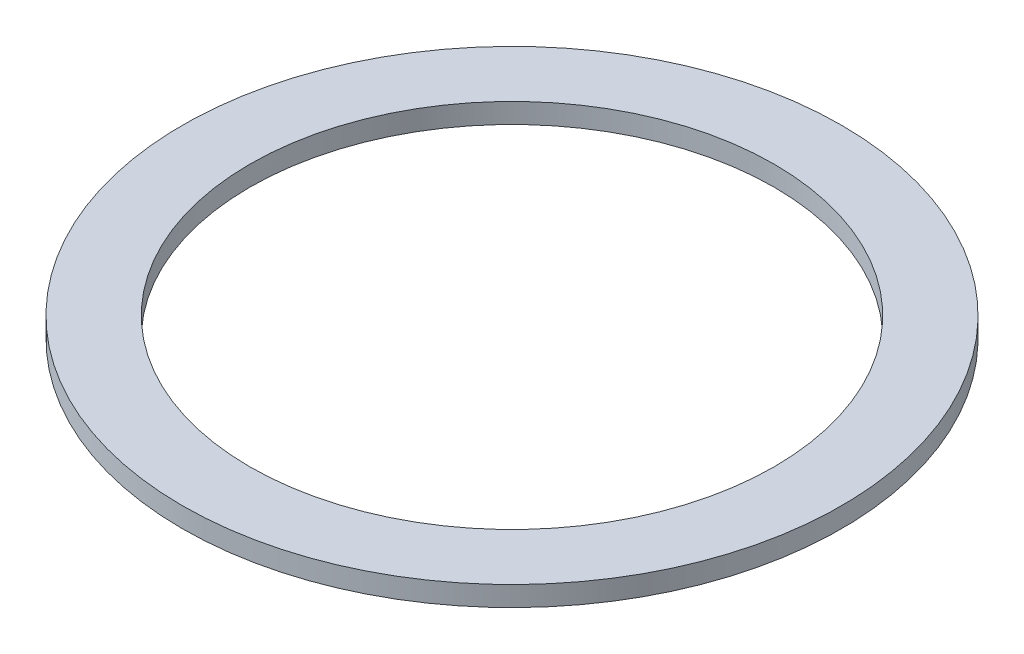
ISO-10303-21;
HEADER;
FILE_DESCRIPTION(('STEP AP214'),'2;1');
FILE_NAME('part.step','',(''),(''),'','','');
FILE_SCHEMA(('AUTOMOTIVE_DESIGN { 1 0 10303 214 1 1 1 1 }'));
ENDSEC;
DATA;
#1=APPLICATION_CONTEXT('core data for automotive mechanical design processes');
#2=APPLICATION_PROTOCOL_DEFINITION('international standard','automotive_design',2000,#1);
#3=PRODUCT_CONTEXT('',#1,'mechanical');
#4=PRODUCT('Part','Part','',(#3));
#5=PRODUCT_RELATED_PRODUCT_CATEGORY('part','',(#4));
#6=PRODUCT_DEFINITION_FORMATION('','',#4);
#7=PRODUCT_DEFINITION_CONTEXT('part definition',#1,'design');
#8=PRODUCT_DEFINITION('design','',#6,#7);
#9=PRODUCT_DEFINITION_SHAPE('','',#8);
#10=(LENGTH_UNIT() NAMED_UNIT(*) SI_UNIT(.MILLI.,.METRE.));
#11=(NAMED_UNIT(*) PLANE_ANGLE_UNIT() SI_UNIT($,.RADIAN.));
#12=(NAMED_UNIT(*) SI_UNIT($,.STERADIAN.) SOLID_ANGLE_UNIT());
#13=UNCERTAINTY_MEASURE_WITH_UNIT(LENGTH_MEASURE(1.E-05),#10,'distance_accuracy_value','');
#14=(GEOMETRIC_REPRESENTATION_CONTEXT(3) GLOBAL_UNCERTAINTY_ASSIGNED_CONTEXT((#13)) GLOBAL_UNIT_ASSIGNED_CONTEXT((#10,
#11,#12)) REPRESENTATION_CONTEXT('',''));
#15=CARTESIAN_POINT('',(0.,0.,0.));
#16=DIRECTION('',(0.,0.,1.));
#17=DIRECTION('',(1.,0.,0.));
#18=AXIS2_PLACEMENT_3D('',#15,#16,#17);
#19=CARTESIAN_POINT('',(0.,2.,0.));
#20=DIRECTION('',(0.,1.,0.));
#21=DIRECTION('',(0.,0.,1.));
#22=AXIS2_PLACEMENT_3D('',#19,#20,#21);
#23=PLANE('',#22);
#24=CARTESIAN_POINT('',(0.,2.,0.));
#25=DIRECTION('',(0.,1.,0.));
#26=DIRECTION('',(0.,0.,1.));
#27=AXIS2_PLACEMENT_3D('',#24,#25,#26);
#28=CIRCLE('',#27,33.);
#29=CARTESIAN_POINT('',(0.,2.,33.));
#30=VERTEX_POINT('',#29);
#31=EDGE_CURVE('E10',#30,#30,#28,.T.);
#32=ORIENTED_EDGE('',*,*,#31,.T.);
#33=EDGE_LOOP('',(#32));
#34=FACE_BOUND('',#33,.T.);
#35=CARTESIAN_POINT('',(0.,2.,0.));
#36=DIRECTION('',(0.,1.,0.));
#37=DIRECTION('',(0.,0.,1.));
#38=AXIS2_PLACEMENT_3D('',#35,#36,#37);
#39=CIRCLE('',#38,26.25);
#40=CARTESIAN_POINT('',(0.,2.,26.25));
#41=VERTEX_POINT('',#40);
#42=EDGE_CURVE('E44',#41,#41,#39,.T.);
#43=ORIENTED_EDGE('',*,*,#42,.F.);
#44=EDGE_LOOP('',(#43));
#45=FACE_BOUND('',#44,.T.);
#46=ADVANCED_FACE('F33',(#34,#45),#23,.T.);
#47=CARTESIAN_POINT('',(0.,0.,0.));
#48=DIRECTION('',(0.,1.,0.));
#49=DIRECTION('',(0.,0.,1.));
#50=AXIS2_PLACEMENT_3D('',#47,#48,#49);
#51=PLANE('',#50);
#52=CARTESIAN_POINT('',(0.,0.,0.));
#53=DIRECTION('',(0.,1.,0.));
#54=DIRECTION('',(0.,0.,1.));
#55=AXIS2_PLACEMENT_3D('',#52,#53,#54);
#56=CIRCLE('',#55,33.);
#57=CARTESIAN_POINT('',(0.,0.,33.));
#58=VERTEX_POINT('',#57);
#59=EDGE_CURVE('E37',#58,#58,#56,.T.);
#60=ORIENTED_EDGE('',*,*,#59,.F.);
#61=EDGE_LOOP('',(#60));
#62=FACE_BOUND('',#61,.T.);
#63=CARTESIAN_POINT('',(0.,0.,0.));
#64=DIRECTION('',(0.,1.,0.));
#65=DIRECTION('',(0.,0.,1.));
#66=AXIS2_PLACEMENT_3D('',#63,#64,#65);
#67=CIRCLE('',#66,26.25);
#68=CARTESIAN_POINT('',(0.,0.,26.25));
#69=VERTEX_POINT('',#68);
#70=EDGE_CURVE('E46',#69,#69,#67,.T.);
#71=ORIENTED_EDGE('',*,*,#70,.T.);
#72=EDGE_LOOP('',(#71));
#73=FACE_BOUND('',#72,.T.);
#74=ADVANCED_FACE('F56',(#62,#73),#51,.F.);
#75=CARTESIAN_POINT('',(0.,2.,0.));
#76=DIRECTION('',(0.,-1.,0.));
#77=DIRECTION('',(0.,0.,-1.));
#78=AXIS2_PLACEMENT_3D('',#75,#76,#77);
#79=CYLINDRICAL_SURFACE('',#78,33.);
#80=ORIENTED_EDGE('',*,*,#31,.F.);
#81=EDGE_LOOP('',(#80));
#82=FACE_BOUND('',#81,.T.);
#83=ORIENTED_EDGE('',*,*,#59,.T.);
#84=EDGE_LOOP('',(#83));
#85=FACE_BOUND('',#84,.T.);
#86=ADVANCED_FACE('F35',(#82,#85),#79,.T.);
#87=CARTESIAN_POINT('',(0.,2.,0.));
#88=DIRECTION('',(0.,-1.,0.));
#89=DIRECTION('',(0.,0.,-1.));
#90=AXIS2_PLACEMENT_3D('',#87,#88,#89);
#91=CYLINDRICAL_SURFACE('',#90,26.25);
#92=ORIENTED_EDGE('',*,*,#42,.T.);
#93=EDGE_LOOP('',(#92));
#94=FACE_BOUND('',#93,.T.);
#95=ORIENTED_EDGE('',*,*,#70,.F.);
#96=EDGE_LOOP('',(#95));
#97=FACE_BOUND('',#96,.T.);
#98=ADVANCED_FACE('F52',(#94,#97),#91,.F.);
#99=CLOSED_SHELL('',(#46,#74,#86,#98));
#100=MANIFOLD_SOLID_BREP('B2',#99);
#101=ADVANCED_BREP_SHAPE_REPRESENTATION('',(#18,#100),#14);
#102=SHAPE_DEFINITION_REPRESENTATION(#9,#101);
ENDSEC;
END-ISO-10303-21;
